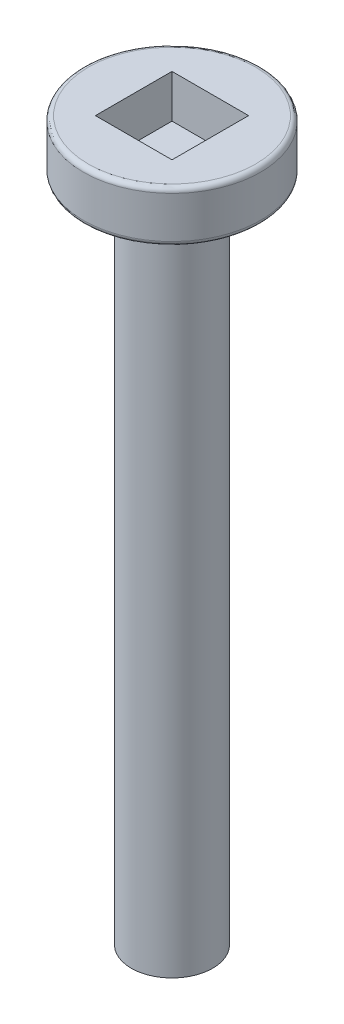
ISO-10303-21;
HEADER;
FILE_DESCRIPTION(('STEP AP214'),'2;1');
FILE_NAME('part.step','',(''),(''),'','','');
FILE_SCHEMA(('AUTOMOTIVE_DESIGN { 1 0 10303 214 1 1 1 1 }'));
ENDSEC;
DATA;
#1=APPLICATION_CONTEXT('core data for automotive mechanical design processes');
#2=APPLICATION_PROTOCOL_DEFINITION('international standard','automotive_design',2000,#1);
#3=PRODUCT_CONTEXT('',#1,'mechanical');
#4=PRODUCT('Part','Part','',(#3));
#5=PRODUCT_RELATED_PRODUCT_CATEGORY('part','',(#4));
#6=PRODUCT_DEFINITION_FORMATION('','',#4);
#7=PRODUCT_DEFINITION_CONTEXT('part definition',#1,'design');
#8=PRODUCT_DEFINITION('design','',#6,#7);
#9=PRODUCT_DEFINITION_SHAPE('','',#8);
#10=(LENGTH_UNIT() NAMED_UNIT(*) SI_UNIT(.MILLI.,.METRE.));
#11=(NAMED_UNIT(*) PLANE_ANGLE_UNIT() SI_UNIT($,.RADIAN.));
#12=(NAMED_UNIT(*) SI_UNIT($,.STERADIAN.) SOLID_ANGLE_UNIT());
#13=UNCERTAINTY_MEASURE_WITH_UNIT(LENGTH_MEASURE(1.E-05),#10,'distance_accuracy_value','');
#14=(GEOMETRIC_REPRESENTATION_CONTEXT(3) GLOBAL_UNCERTAINTY_ASSIGNED_CONTEXT((#13)) GLOBAL_UNIT_ASSIGNED_CONTEXT((#10,
#11,#12)) REPRESENTATION_CONTEXT('',''));
#15=CARTESIAN_POINT('',(0.,0.,0.));
#16=DIRECTION('',(0.,0.,1.));
#17=DIRECTION('',(1.,0.,0.));
#18=AXIS2_PLACEMENT_3D('',#15,#16,#17);
#19=CARTESIAN_POINT('',(0.,-2.7178,0.));
#20=DIRECTION('',(0.,1.,0.));
#21=DIRECTION('',(0.,0.,1.));
#22=AXIS2_PLACEMENT_3D('',#19,#20,#21);
#23=CYLINDRICAL_SURFACE('',#22,4.699);
#24=CARTESIAN_POINT('',(0.,-2.4638,0.));
#25=DIRECTION('',(0.,1.,0.));
#26=DIRECTION('',(0.,0.,1.));
#27=AXIS2_PLACEMENT_3D('',#24,#25,#26);
#28=CIRCLE('',#27,4.699);
#29=CARTESIAN_POINT('',(0.,-2.4638,4.699));
#30=VERTEX_POINT('',#29);
#31=EDGE_CURVE('E122',#30,#30,#28,.T.);
#32=ORIENTED_EDGE('',*,*,#31,.T.);
#33=EDGE_LOOP('',(#32));
#34=FACE_BOUND('',#33,.T.);
#35=CARTESIAN_POINT('',(0.,-0.254,0.));
#36=DIRECTION('',(0.,1.,0.));
#37=DIRECTION('',(0.,0.,1.));
#38=AXIS2_PLACEMENT_3D('',#35,#36,#37);
#39=CIRCLE('',#38,4.699);
#40=CARTESIAN_POINT('',(0.,-0.254,4.699));
#41=VERTEX_POINT('',#40);
#42=EDGE_CURVE('E119',#41,#41,#39,.F.);
#43=ORIENTED_EDGE('',*,*,#42,.T.);
#44=EDGE_LOOP('',(#43));
#45=FACE_BOUND('',#44,.T.);
#46=ADVANCED_FACE('F35',(#34,#45),#23,.T.);
#47=CARTESIAN_POINT('',(0.,-2.7178,0.));
#48=DIRECTION('',(0.,1.,0.));
#49=DIRECTION('',(0.,0.,1.));
#50=AXIS2_PLACEMENT_3D('',#47,#48,#49);
#51=PLANE('',#50);
#52=CARTESIAN_POINT('',(0.,-2.7178,0.));
#53=DIRECTION('',(0.,1.,0.));
#54=DIRECTION('',(0.,0.,1.));
#55=AXIS2_PLACEMENT_3D('',#52,#53,#54);
#56=CIRCLE('',#55,4.445);
#57=CARTESIAN_POINT('',(0.,-2.7178,4.445));
#58=VERTEX_POINT('',#57);
#59=EDGE_CURVE('E43',#58,#58,#56,.F.);
#60=ORIENTED_EDGE('',*,*,#59,.T.);
#61=EDGE_LOOP('',(#60));
#62=FACE_BOUND('',#61,.T.);
#63=CARTESIAN_POINT('',(0.,-2.7178,0.));
#64=DIRECTION('',(0.,1.,0.));
#65=DIRECTION('',(0.,0.,1.));
#66=AXIS2_PLACEMENT_3D('',#63,#64,#65);
#67=CIRCLE('',#66,2.159);
#68=CARTESIAN_POINT('',(0.,-2.71780000000001,2.159));
#69=VERTEX_POINT('',#68);
#70=EDGE_CURVE('E116',#69,#69,#67,.T.);
#71=ORIENTED_EDGE('',*,*,#70,.T.);
#72=EDGE_LOOP('',(#71));
#73=FACE_BOUND('',#72,.T.);
#74=ADVANCED_FACE('F127',(#62,#73),#51,.F.);
#75=CARTESIAN_POINT('',(0.,0.,0.));
#76=DIRECTION('',(0.,1.,0.));
#77=DIRECTION('',(0.,0.,1.));
#78=AXIS2_PLACEMENT_3D('',#75,#76,#77);
#79=PLANE('',#78);
#80=CARTESIAN_POINT('',(0.,0.,0.));
#81=DIRECTION('',(0.,1.,0.));
#82=DIRECTION('',(0.,0.,1.));
#83=AXIS2_PLACEMENT_3D('',#80,#81,#82);
#84=CIRCLE('',#83,4.445);
#85=CARTESIAN_POINT('',(0.,0.,4.445));
#86=VERTEX_POINT('',#85);
#87=EDGE_CURVE('E11',#86,#86,#84,.T.);
#88=ORIENTED_EDGE('',*,*,#87,.T.);
#89=EDGE_LOOP('',(#88));
#90=FACE_BOUND('',#89,.T.);
#91=DIRECTION('',(0.,0.,1.));
#92=VECTOR('',#91,1.);
#93=CARTESIAN_POINT('',(-2.032,0.,-2.032));
#94=LINE('',#93,#92);
#95=CARTESIAN_POINT('',(-2.032,0.,-2.032));
#96=VERTEX_POINT('',#95);
#97=CARTESIAN_POINT('',(-2.032,0.,2.032));
#98=VERTEX_POINT('',#97);
#99=EDGE_CURVE('E50',#96,#98,#94,.T.);
#100=ORIENTED_EDGE('',*,*,#99,.F.);
#101=DIRECTION('',(-1.,0.,0.));
#102=VECTOR('',#101,1.);
#103=CARTESIAN_POINT('',(-2.032,0.,-2.032));
#104=LINE('',#103,#102);
#105=CARTESIAN_POINT('',(2.032,0.,-2.032));
#106=VERTEX_POINT('',#105);
#107=EDGE_CURVE('E101',#106,#96,#104,.T.);
#108=ORIENTED_EDGE('',*,*,#107,.F.);
#109=DIRECTION('',(0.,0.,-1.));
#110=VECTOR('',#109,1.);
#111=CARTESIAN_POINT('',(2.032,0.,-2.032));
#112=LINE('',#111,#110);
#113=CARTESIAN_POINT('',(2.032,0.,2.032));
#114=VERTEX_POINT('',#113);
#115=EDGE_CURVE('E107',#114,#106,#112,.T.);
#116=ORIENTED_EDGE('',*,*,#115,.F.);
#117=DIRECTION('',(1.,0.,0.));
#118=VECTOR('',#117,1.);
#119=CARTESIAN_POINT('',(-2.032,0.,2.032));
#120=LINE('',#119,#118);
#121=EDGE_CURVE('E85',#98,#114,#120,.T.);
#122=ORIENTED_EDGE('',*,*,#121,.F.);
#123=EDGE_LOOP('',(#100,#108,#116,#122));
#124=FACE_BOUND('',#123,.T.);
#125=ADVANCED_FACE('F144',(#90,#124),#79,.T.);
#126=CARTESIAN_POINT('',(0.,-38.1,0.));
#127=DIRECTION('',(0.,1.,0.));
#128=DIRECTION('',(0.,0.,1.));
#129=AXIS2_PLACEMENT_3D('',#126,#127,#128);
#130=CYLINDRICAL_SURFACE('',#129,2.159);
#131=CARTESIAN_POINT('',(0.,-38.1,0.));
#132=DIRECTION('',(0.,1.,0.));
#133=DIRECTION('',(0.,0.,1.));
#134=AXIS2_PLACEMENT_3D('',#131,#132,#133);
#135=CIRCLE('',#134,2.159);
#136=CARTESIAN_POINT('',(0.,-38.1,2.159));
#137=VERTEX_POINT('',#136);
#138=EDGE_CURVE('E111',#137,#137,#135,.T.);
#139=CARTESIAN_POINT('',(0.,-38.1,2.159));
#140=CARTESIAN_POINT('',(0.,-37.7314354166667,2.159));
#141=CARTESIAN_POINT('',(0.,-37.3628708333333,2.159));
#142=CARTESIAN_POINT('',(0.,-36.6257416666667,2.159));
#143=CARTESIAN_POINT('',(0.,-36.2571770833333,2.159));
#144=CARTESIAN_POINT('',(0.,-35.5200479166667,2.159));
#145=CARTESIAN_POINT('',(0.,-35.1514833333333,2.159));
#146=CARTESIAN_POINT('',(0.,-34.4143541666667,2.159));
#147=CARTESIAN_POINT('',(0.,-34.0457895833333,2.159));
#148=CARTESIAN_POINT('',(0.,-33.3086604166667,2.159));
#149=CARTESIAN_POINT('',(0.,-32.9400958333333,2.159));
#150=CARTESIAN_POINT('',(0.,-32.2029666666667,2.159));
#151=CARTESIAN_POINT('',(0.,-31.8344020833333,2.159));
#152=CARTESIAN_POINT('',(0.,-31.0972729166667,2.159));
#153=CARTESIAN_POINT('',(0.,-30.7287083333333,2.159));
#154=CARTESIAN_POINT('',(0.,-29.9915791666667,2.159));
#155=CARTESIAN_POINT('',(0.,-29.6230145833333,2.159));
#156=CARTESIAN_POINT('',(0.,-28.8858854166667,2.159));
#157=CARTESIAN_POINT('',(0.,-28.5173208333333,2.159));
#158=CARTESIAN_POINT('',(0.,-27.7801916666667,2.159));
#159=CARTESIAN_POINT('',(0.,-27.4116270833333,2.159));
#160=CARTESIAN_POINT('',(0.,-26.6744979166667,2.159));
#161=CARTESIAN_POINT('',(0.,-26.3059333333333,2.159));
#162=CARTESIAN_POINT('',(0.,-25.5688041666667,2.159));
#163=CARTESIAN_POINT('',(0.,-25.2002395833333,2.159));
#164=CARTESIAN_POINT('',(0.,-24.4631104166667,2.159));
#165=CARTESIAN_POINT('',(0.,-24.0945458333333,2.159));
#166=CARTESIAN_POINT('',(0.,-23.3574166666667,2.159));
#167=CARTESIAN_POINT('',(0.,-22.9888520833333,2.159));
#168=CARTESIAN_POINT('',(0.,-22.2517229166667,2.159));
#169=CARTESIAN_POINT('',(0.,-21.8831583333333,2.159));
#170=CARTESIAN_POINT('',(0.,-21.1460291666667,2.159));
#171=CARTESIAN_POINT('',(0.,-20.7774645833333,2.159));
#172=CARTESIAN_POINT('',(0.,-20.0403354166667,2.159));
#173=CARTESIAN_POINT('',(0.,-19.6717708333333,2.159));
#174=CARTESIAN_POINT('',(0.,-18.9346416666667,2.159));
#175=CARTESIAN_POINT('',(0.,-18.5660770833333,2.159));
#176=CARTESIAN_POINT('',(0.,-17.8289479166667,2.159));
#177=CARTESIAN_POINT('',(0.,-17.4603833333333,2.159));
#178=CARTESIAN_POINT('',(0.,-16.7232541666667,2.159));
#179=CARTESIAN_POINT('',(0.,-16.3546895833333,2.159));
#180=CARTESIAN_POINT('',(0.,-15.6175604166667,2.159));
#181=CARTESIAN_POINT('',(0.,-15.2489958333333,2.159));
#182=CARTESIAN_POINT('',(0.,-14.5118666666667,2.159));
#183=CARTESIAN_POINT('',(0.,-14.1433020833333,2.159));
#184=CARTESIAN_POINT('',(0.,-13.4061729166667,2.159));
#185=CARTESIAN_POINT('',(0.,-13.0376083333333,2.159));
#186=CARTESIAN_POINT('',(0.,-12.3004791666667,2.159));
#187=CARTESIAN_POINT('',(0.,-11.9319145833333,2.159));
#188=CARTESIAN_POINT('',(0.,-11.1947854166667,2.159));
#189=CARTESIAN_POINT('',(0.,-10.8262208333333,2.159));
#190=CARTESIAN_POINT('',(0.,-10.0890916666667,2.159));
#191=CARTESIAN_POINT('',(0.,-9.72052708333334,2.159));
#192=CARTESIAN_POINT('',(0.,-8.98339791666667,2.159));
#193=CARTESIAN_POINT('',(0.,-8.61483333333333,2.159));
#194=CARTESIAN_POINT('',(0.,-7.87770416666667,2.159));
#195=CARTESIAN_POINT('',(0.,-7.50913958333333,2.159));
#196=CARTESIAN_POINT('',(0.,-6.77201041666667,2.159));
#197=CARTESIAN_POINT('',(0.,-6.40344583333334,2.159));
#198=CARTESIAN_POINT('',(0.,-5.66631666666667,2.159));
#199=CARTESIAN_POINT('',(0.,-5.29775208333334,2.159));
#200=CARTESIAN_POINT('',(0.,-4.56062291666667,2.159));
#201=CARTESIAN_POINT('',(0.,-4.19205833333334,2.159));
#202=CARTESIAN_POINT('',(0.,-3.45492916666667,2.159));
#203=CARTESIAN_POINT('',(0.,-3.08636458333334,2.159));
#204=CARTESIAN_POINT('',(0.,-2.71780000000001,2.159));
#205=B_SPLINE_CURVE_WITH_KNOTS('',3,(#139,#140,#141,#142,#143,#144,#145,#146,#147,#148,#149,
#150,#151,#152,#153,#154,#155,#156,#157,#158,#159,#160,#161,#162,#163,#164,#165,#166,#167,#168,
#169,#170,#171,#172,#173,#174,#175,#176,#177,#178,#179,#180,#181,#182,#183,#184,#185,#186,#187,
#188,#189,#190,#191,#192,#193,#194,#195,#196,#197,#198,#199,#200,#201,#202,#203,#204),
.UNSPECIFIED.,.F.,.F.,(4,2,2,2,2,2,2,2,2,2,2,2,2,2,2,2,2,2,2,2,2,2,2,2,2,2,2,2,2,2,2,2,4),(0.,
1.10569375,2.2113875,3.31708125000001,4.422775,5.52846875,6.63416250000001,7.73985625,8.84555,
9.95124375000001,11.0569375,12.16263125,13.268325,14.37401875,15.4797125,16.58540625,17.6911,
18.79679375,19.9024875,21.00818125,22.113875,23.21956875,24.3252625,25.43095625,26.53665,
27.64234375,28.7480375,29.85373125,30.959425,32.06511875,33.1708125,34.27650625,35.3822),.UNSPECIFIED.);
#206=EDGE_CURVE('BSEAM147',#137,#69,#205,.T.);
#207=ORIENTED_EDGE('',*,*,#138,.T.);
#208=ORIENTED_EDGE('',*,*,#70,.F.);
#209=ORIENTED_EDGE('',*,*,#206,.T.);
#210=ORIENTED_EDGE('',*,*,#206,.F.);
#211=EDGE_LOOP('',(#207,#209,#208,#210));
#212=FACE_BOUND('',#211,.T.);
#213=ADVANCED_FACE('F147',(#212),#130,.T.);
#214=CARTESIAN_POINT('',(0.,-38.1,0.));
#215=DIRECTION('',(0.,1.,0.));
#216=DIRECTION('',(0.,0.,1.));
#217=AXIS2_PLACEMENT_3D('',#214,#215,#216);
#218=PLANE('',#217);
#219=ORIENTED_EDGE('',*,*,#138,.F.);
#220=EDGE_LOOP('',(#219));
#221=FACE_BOUND('',#220,.T.);
#222=ADVANCED_FACE('F159',(#221),#218,.F.);
#223=CARTESIAN_POINT('',(-2.032,-2.286,-2.032));
#224=DIRECTION('',(-1.,0.,0.));
#225=DIRECTION('',(0.,0.,1.));
#226=AXIS2_PLACEMENT_3D('',#223,#224,#225);
#227=PLANE('',#226);
#228=ORIENTED_EDGE('',*,*,#99,.T.);
#229=DIRECTION('',(0.,1.,0.));
#230=VECTOR('',#229,1.);
#231=CARTESIAN_POINT('',(-2.032,-2.286,2.032));
#232=LINE('',#231,#230);
#233=CARTESIAN_POINT('',(-2.032,-2.286,2.032));
#234=VERTEX_POINT('',#233);
#235=EDGE_CURVE('E73',#234,#98,#232,.T.);
#236=ORIENTED_EDGE('',*,*,#235,.F.);
#237=DIRECTION('',(0.,0.,1.));
#238=VECTOR('',#237,1.);
#239=CARTESIAN_POINT('',(-2.032,-2.286,-2.032));
#240=LINE('',#239,#238);
#241=CARTESIAN_POINT('',(-2.032,-2.286,-2.032));
#242=VERTEX_POINT('',#241);
#243=EDGE_CURVE('E99',#242,#234,#240,.T.);
#244=ORIENTED_EDGE('',*,*,#243,.F.);
#245=DIRECTION('',(0.,1.,0.));
#246=VECTOR('',#245,1.);
#247=CARTESIAN_POINT('',(-2.032,-2.286,-2.032));
#248=LINE('',#247,#246);
#249=EDGE_CURVE('E58',#242,#96,#248,.T.);
#250=ORIENTED_EDGE('',*,*,#249,.T.);
#251=EDGE_LOOP('',(#228,#236,#244,#250));
#252=FACE_BOUND('',#251,.T.);
#253=ADVANCED_FACE('F152',(#252),#227,.F.);
#254=CARTESIAN_POINT('',(-2.032,-2.286,-2.032));
#255=DIRECTION('',(0.,0.,-1.));
#256=DIRECTION('',(-1.,0.,0.));
#257=AXIS2_PLACEMENT_3D('',#254,#255,#256);
#258=PLANE('',#257);
#259=ORIENTED_EDGE('',*,*,#107,.T.);
#260=ORIENTED_EDGE('',*,*,#249,.F.);
#261=DIRECTION('',(-1.,0.,0.));
#262=VECTOR('',#261,1.);
#263=CARTESIAN_POINT('',(-2.032,-2.286,-2.032));
#264=LINE('',#263,#262);
#265=CARTESIAN_POINT('',(2.032,-2.286,-2.032));
#266=VERTEX_POINT('',#265);
#267=EDGE_CURVE('E96',#266,#242,#264,.T.);
#268=ORIENTED_EDGE('',*,*,#267,.F.);
#269=DIRECTION('',(0.,1.,0.));
#270=VECTOR('',#269,1.);
#271=CARTESIAN_POINT('',(2.032,-2.286,-2.032));
#272=LINE('',#271,#270);
#273=EDGE_CURVE('E89',#266,#106,#272,.T.);
#274=ORIENTED_EDGE('',*,*,#273,.T.);
#275=EDGE_LOOP('',(#259,#260,#268,#274));
#276=FACE_BOUND('',#275,.T.);
#277=ADVANCED_FACE('F150',(#276),#258,.F.);
#278=CARTESIAN_POINT('',(2.032,-2.286,-2.032));
#279=DIRECTION('',(1.,0.,0.));
#280=DIRECTION('',(0.,0.,-1.));
#281=AXIS2_PLACEMENT_3D('',#278,#279,#280);
#282=PLANE('',#281);
#283=ORIENTED_EDGE('',*,*,#115,.T.);
#284=ORIENTED_EDGE('',*,*,#273,.F.);
#285=DIRECTION('',(0.,0.,-1.));
#286=VECTOR('',#285,1.);
#287=CARTESIAN_POINT('',(2.032,-2.286,-2.032));
#288=LINE('',#287,#286);
#289=CARTESIAN_POINT('',(2.032,-2.286,2.032));
#290=VERTEX_POINT('',#289);
#291=EDGE_CURVE('E92',#290,#266,#288,.T.);
#292=ORIENTED_EDGE('',*,*,#291,.F.);
#293=DIRECTION('',(0.,1.,0.));
#294=VECTOR('',#293,1.);
#295=CARTESIAN_POINT('',(2.032,-2.286,2.032));
#296=LINE('',#295,#294);
#297=EDGE_CURVE('E78',#290,#114,#296,.T.);
#298=ORIENTED_EDGE('',*,*,#297,.T.);
#299=EDGE_LOOP('',(#283,#284,#292,#298));
#300=FACE_BOUND('',#299,.T.);
#301=ADVANCED_FACE('F93',(#300),#282,.F.);
#302=CARTESIAN_POINT('',(-2.032,-2.286,2.032));
#303=DIRECTION('',(0.,0.,1.));
#304=DIRECTION('',(1.,0.,0.));
#305=AXIS2_PLACEMENT_3D('',#302,#303,#304);
#306=PLANE('',#305);
#307=ORIENTED_EDGE('',*,*,#121,.T.);
#308=ORIENTED_EDGE('',*,*,#297,.F.);
#309=DIRECTION('',(1.,0.,0.));
#310=VECTOR('',#309,1.);
#311=CARTESIAN_POINT('',(-2.032,-2.286,2.032));
#312=LINE('',#311,#310);
#313=EDGE_CURVE('E82',#234,#290,#312,.T.);
#314=ORIENTED_EDGE('',*,*,#313,.F.);
#315=ORIENTED_EDGE('',*,*,#235,.T.);
#316=EDGE_LOOP('',(#307,#308,#314,#315));
#317=FACE_BOUND('',#316,.T.);
#318=ADVANCED_FACE('F80',(#317),#306,.F.);
#319=CARTESIAN_POINT('',(0.,-2.286,0.));
#320=DIRECTION('',(0.,1.,0.));
#321=DIRECTION('',(0.,0.,1.));
#322=AXIS2_PLACEMENT_3D('',#319,#320,#321);
#323=PLANE('',#322);
#324=ORIENTED_EDGE('',*,*,#243,.T.);
#325=ORIENTED_EDGE('',*,*,#313,.T.);
#326=ORIENTED_EDGE('',*,*,#291,.T.);
#327=ORIENTED_EDGE('',*,*,#267,.T.);
#328=EDGE_LOOP('',(#324,#325,#326,#327));
#329=FACE_BOUND('',#328,.T.);
#330=ADVANCED_FACE('F98',(#329),#323,.T.);
#331=CARTESIAN_POINT('',(0.,-2.4638,0.));
#332=DIRECTION('',(0.,1.,0.));
#333=DIRECTION('',(0.,0.,1.));
#334=AXIS2_PLACEMENT_3D('',#331,#332,#333);
#335=TOROIDAL_SURFACE('',#334,4.445,0.254);
#336=ORIENTED_EDGE('',*,*,#59,.F.);
#337=EDGE_LOOP('',(#336));
#338=FACE_BOUND('',#337,.T.);
#339=ORIENTED_EDGE('',*,*,#31,.F.);
#340=EDGE_LOOP('',(#339));
#341=FACE_BOUND('',#340,.T.);
#342=ADVANCED_FACE('F130',(#338,#341),#335,.T.);
#343=CARTESIAN_POINT('',(0.,-0.254,0.));
#344=DIRECTION('',(0.,1.,0.));
#345=DIRECTION('',(0.,0.,1.));
#346=AXIS2_PLACEMENT_3D('',#343,#344,#345);
#347=TOROIDAL_SURFACE('',#346,4.445,0.254);
#348=ORIENTED_EDGE('',*,*,#42,.F.);
#349=EDGE_LOOP('',(#348));
#350=FACE_BOUND('',#349,.T.);
#351=ORIENTED_EDGE('',*,*,#87,.F.);
#352=EDGE_LOOP('',(#351));
#353=FACE_BOUND('',#352,.T.);
#354=ADVANCED_FACE('F37',(#350,#353),#347,.T.);
#355=CLOSED_SHELL('',(#46,#74,#125,#213,#222,#253,#277,#301,#318,#330,#342,#354));
#356=MANIFOLD_SOLID_BREP('B2',#355);
#357=ADVANCED_BREP_SHAPE_REPRESENTATION('',(#18,#356),#14);
#358=SHAPE_DEFINITION_REPRESENTATION(#9,#357);
ENDSEC;
END-ISO-10303-21;
